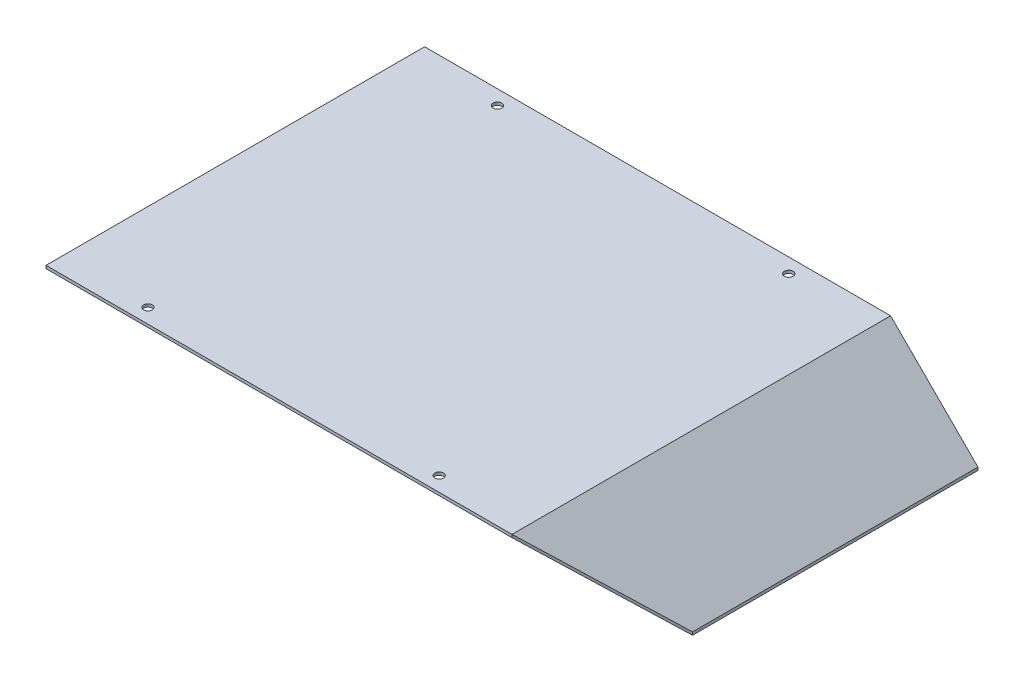
ISO-10303-21;
HEADER;
FILE_DESCRIPTION(('STEP AP214'),'2;1');
FILE_NAME('part.step','',(''),(''),'','','');
FILE_SCHEMA(('AUTOMOTIVE_DESIGN { 1 0 10303 214 1 1 1 1 }'));
ENDSEC;
DATA;
#1=APPLICATION_CONTEXT('core data for automotive mechanical design processes');
#2=APPLICATION_PROTOCOL_DEFINITION('international standard','automotive_design',2000,#1);
#3=PRODUCT_CONTEXT('',#1,'mechanical');
#4=PRODUCT('Part','Part','',(#3));
#5=PRODUCT_RELATED_PRODUCT_CATEGORY('part','',(#4));
#6=PRODUCT_DEFINITION_FORMATION('','',#4);
#7=PRODUCT_DEFINITION_CONTEXT('part definition',#1,'design');
#8=PRODUCT_DEFINITION('design','',#6,#7);
#9=PRODUCT_DEFINITION_SHAPE('','',#8);
#10=(LENGTH_UNIT() NAMED_UNIT(*) SI_UNIT(.MILLI.,.METRE.));
#11=(NAMED_UNIT(*) PLANE_ANGLE_UNIT() SI_UNIT($,.RADIAN.));
#12=(NAMED_UNIT(*) SI_UNIT($,.STERADIAN.) SOLID_ANGLE_UNIT());
#13=UNCERTAINTY_MEASURE_WITH_UNIT(LENGTH_MEASURE(1.E-05),#10,'distance_accuracy_value','');
#14=(GEOMETRIC_REPRESENTATION_CONTEXT(3) GLOBAL_UNCERTAINTY_ASSIGNED_CONTEXT((#13)) GLOBAL_UNIT_ASSIGNED_CONTEXT((#10,
#11,#12)) REPRESENTATION_CONTEXT('',''));
#15=CARTESIAN_POINT('',(0.,0.,0.));
#16=DIRECTION('',(0.,0.,1.));
#17=DIRECTION('',(1.,0.,0.));
#18=AXIS2_PLACEMENT_3D('',#15,#16,#17);
#19=CARTESIAN_POINT('',(0.,0.,98.));
#20=DIRECTION('',(0.707106781186548,-0.707106781186547,0.));
#21=DIRECTION('',(0.,0.,-1.));
#22=AXIS2_PLACEMENT_3D('',#19,#20,#21);
#23=PLANE('',#22);
#24=DIRECTION('',(0.,0.,-1.));
#25=VECTOR('',#24,1.);
#26=CARTESIAN_POINT('',(0.,0.,98.));
#27=LINE('',#26,#25);
#28=CARTESIAN_POINT('',(0.,0.,98.));
#29=VERTEX_POINT('',#28);
#30=CARTESIAN_POINT('',(0.,0.,0.));
#31=VERTEX_POINT('',#30);
#32=EDGE_CURVE('E156',#29,#31,#27,.T.);
#33=ORIENTED_EDGE('',*,*,#32,.T.);
#34=DIRECTION('',(0.707106781186548,0.707106781186548,0.));
#35=VECTOR('',#34,1.);
#36=CARTESIAN_POINT('',(0.,0.,0.));
#37=LINE('',#36,#35);
#38=CARTESIAN_POINT('',(30.,30.,0.));
#39=VERTEX_POINT('',#38);
#40=EDGE_CURVE('E231',#31,#39,#37,.T.);
#41=ORIENTED_EDGE('',*,*,#40,.T.);
#42=DIRECTION('',(0.,0.,-1.));
#43=VECTOR('',#42,1.);
#44=CARTESIAN_POINT('',(30.,30.,0.));
#45=LINE('',#44,#43);
#46=CARTESIAN_POINT('',(30.,30.,130.));
#47=VERTEX_POINT('',#46);
#48=EDGE_CURVE('E184',#47,#39,#45,.T.);
#49=ORIENTED_EDGE('',*,*,#48,.F.);
#50=DIRECTION('',(0.564532447121236,0.564532447121236,0.602167943595985));
#51=VECTOR('',#50,1.);
#52=CARTESIAN_POINT('',(0.,0.,98.));
#53=LINE('',#52,#51);
#54=EDGE_CURVE('E11',#29,#47,#53,.T.);
#55=ORIENTED_EDGE('',*,*,#54,.F.);
#56=EDGE_LOOP('',(#33,#41,#49,#55));
#57=FACE_BOUND('',#56,.T.);
#58=ADVANCED_FACE('F16',(#57),#23,.T.);
#59=CARTESIAN_POINT('',(0.,0.99999999999997,98.));
#60=DIRECTION('',(-0.729537204140085,0.,0.68394112888133));
#61=DIRECTION('',(0.,1.,0.));
#62=AXIS2_PLACEMENT_3D('',#59,#60,#61);
#63=PLANE('',#62);
#64=DIRECTION('',(0.,-1.,0.));
#65=VECTOR('',#64,1.);
#66=CARTESIAN_POINT('',(0.,0.99999999999997,98.));
#67=LINE('',#66,#65);
#68=CARTESIAN_POINT('',(0.,0.99999999999997,98.));
#69=VERTEX_POINT('',#68);
#70=EDGE_CURVE('E160',#69,#29,#67,.T.);
#71=ORIENTED_EDGE('',*,*,#70,.T.);
#72=ORIENTED_EDGE('',*,*,#54,.T.);
#73=DIRECTION('',(0.,-1.,0.));
#74=VECTOR('',#73,1.);
#75=CARTESIAN_POINT('',(30.,30.,130.));
#76=LINE('',#75,#74);
#77=CARTESIAN_POINT('',(30.,31.,130.));
#78=VERTEX_POINT('',#77);
#79=EDGE_CURVE('E150',#78,#47,#76,.T.);
#80=ORIENTED_EDGE('',*,*,#79,.F.);
#81=DIRECTION('',(0.564532447121236,0.564532447121236,0.602167943595985));
#82=VECTOR('',#81,1.);
#83=CARTESIAN_POINT('',(0.,0.99999999999997,98.));
#84=LINE('',#83,#82);
#85=EDGE_CURVE('E27',#69,#78,#84,.T.);
#86=ORIENTED_EDGE('',*,*,#85,.F.);
#87=EDGE_LOOP('',(#71,#72,#80,#86));
#88=FACE_BOUND('',#87,.T.);
#89=ADVANCED_FACE('F282',(#88),#63,.T.);
#90=CARTESIAN_POINT('',(0.,1.,0.));
#91=DIRECTION('',(-0.707106781186548,0.707106781186547,0.));
#92=DIRECTION('',(0.,0.,1.));
#93=AXIS2_PLACEMENT_3D('',#90,#91,#92);
#94=PLANE('',#93);
#95=DIRECTION('',(0.,0.,1.));
#96=VECTOR('',#95,1.);
#97=CARTESIAN_POINT('',(0.,1.,0.));
#98=LINE('',#97,#96);
#99=CARTESIAN_POINT('',(0.,1.,0.));
#100=VERTEX_POINT('',#99);
#101=EDGE_CURVE('E220',#100,#69,#98,.T.);
#102=ORIENTED_EDGE('',*,*,#101,.T.);
#103=ORIENTED_EDGE('',*,*,#85,.T.);
#104=DIRECTION('',(0.,0.,1.));
#105=VECTOR('',#104,1.);
#106=CARTESIAN_POINT('',(30.,31.,130.));
#107=LINE('',#106,#105);
#108=CARTESIAN_POINT('',(30.,31.,0.));
#109=VERTEX_POINT('',#108);
#110=EDGE_CURVE('E185',#109,#78,#107,.T.);
#111=ORIENTED_EDGE('',*,*,#110,.F.);
#112=DIRECTION('',(0.707106781186547,0.707106781186548,0.));
#113=VECTOR('',#112,1.);
#114=CARTESIAN_POINT('',(0.,1.,0.));
#115=LINE('',#114,#113);
#116=EDGE_CURVE('E229',#100,#109,#115,.T.);
#117=ORIENTED_EDGE('',*,*,#116,.F.);
#118=EDGE_LOOP('',(#102,#103,#111,#117));
#119=FACE_BOUND('',#118,.T.);
#120=ADVANCED_FACE('F276',(#119),#94,.T.);
#121=CARTESIAN_POINT('',(0.,0.,0.));
#122=DIRECTION('',(0.,0.,-1.));
#123=DIRECTION('',(-1.,0.,0.));
#124=AXIS2_PLACEMENT_3D('',#121,#122,#123);
#125=PLANE('',#124);
#126=DIRECTION('',(0.,1.,0.));
#127=VECTOR('',#126,1.);
#128=CARTESIAN_POINT('',(0.,0.,0.));
#129=LINE('',#128,#127);
#130=EDGE_CURVE('E161',#31,#100,#129,.T.);
#131=ORIENTED_EDGE('',*,*,#130,.T.);
#132=ORIENTED_EDGE('',*,*,#116,.T.);
#133=DIRECTION('',(1.,0.,0.));
#134=VECTOR('',#133,1.);
#135=CARTESIAN_POINT('',(30.,31.,0.));
#136=LINE('',#135,#134);
#137=CARTESIAN_POINT('',(190.,31.,0.));
#138=VERTEX_POINT('',#137);
#139=EDGE_CURVE('E189',#109,#138,#136,.T.);
#140=ORIENTED_EDGE('',*,*,#139,.T.);
#141=DIRECTION('',(0.707106781186548,-0.707106781186547,0.));
#142=VECTOR('',#141,1.);
#143=CARTESIAN_POINT('',(190.,31.,0.));
#144=LINE('',#143,#142);
#145=CARTESIAN_POINT('',(220.,1.,0.));
#146=VERTEX_POINT('',#145);
#147=EDGE_CURVE('E168',#138,#146,#144,.T.);
#148=ORIENTED_EDGE('',*,*,#147,.T.);
#149=DIRECTION('',(0.,1.,0.));
#150=VECTOR('',#149,1.);
#151=CARTESIAN_POINT('',(220.,0.,0.));
#152=LINE('',#151,#150);
#153=CARTESIAN_POINT('',(220.,0.,0.));
#154=VERTEX_POINT('',#153);
#155=EDGE_CURVE('E213',#154,#146,#152,.T.);
#156=ORIENTED_EDGE('',*,*,#155,.F.);
#157=DIRECTION('',(0.707106781186548,-0.707106781186548,0.));
#158=VECTOR('',#157,1.);
#159=CARTESIAN_POINT('',(190.,30.,0.));
#160=LINE('',#159,#158);
#161=CARTESIAN_POINT('',(190.,30.,0.));
#162=VERTEX_POINT('',#161);
#163=EDGE_CURVE('E246',#162,#154,#160,.T.);
#164=ORIENTED_EDGE('',*,*,#163,.F.);
#165=DIRECTION('',(1.,0.,0.));
#166=VECTOR('',#165,1.);
#167=CARTESIAN_POINT('',(30.,30.,0.));
#168=LINE('',#167,#166);
#169=EDGE_CURVE('E181',#39,#162,#168,.T.);
#170=ORIENTED_EDGE('',*,*,#169,.F.);
#171=ORIENTED_EDGE('',*,*,#40,.F.);
#172=EDGE_LOOP('',(#131,#132,#140,#148,#156,#164,#170,#171));
#173=FACE_BOUND('',#172,.T.);
#174=ADVANCED_FACE('F490',(#173),#125,.T.);
#175=CARTESIAN_POINT('',(0.,0.499999999999985,49.));
#176=DIRECTION('',(1.,0.,0.));
#177=DIRECTION('',(0.,1.,0.));
#178=AXIS2_PLACEMENT_3D('',#175,#176,#177);
#179=PLANE('',#178);
#180=ORIENTED_EDGE('',*,*,#130,.F.);
#181=ORIENTED_EDGE('',*,*,#32,.F.);
#182=ORIENTED_EDGE('',*,*,#70,.F.);
#183=ORIENTED_EDGE('',*,*,#101,.F.);
#184=EDGE_LOOP('',(#180,#181,#182,#183));
#185=FACE_BOUND('',#184,.T.);
#186=ADVANCED_FACE('F281',(#185),#179,.F.);
#187=CARTESIAN_POINT('',(30.,31.,130.));
#188=DIRECTION('',(0.,-1.,0.));
#189=DIRECTION('',(0.,0.,-1.));
#190=AXIS2_PLACEMENT_3D('',#187,#188,#189);
#191=PLANE('',#190);
#192=CARTESIAN_POINT('',(160.,31.,5.));
#193=DIRECTION('',(0.,-1.,0.));
#194=DIRECTION('',(1.,0.,0.));
#195=AXIS2_PLACEMENT_3D('',#192,#193,#194);
#196=CIRCLE('',#195,1.5);
#197=CARTESIAN_POINT('',(158.5,31.,5.));
#198=VERTEX_POINT('',#197);
#199=EDGE_CURVE('E173',#198,#198,#196,.T.);
#200=ORIENTED_EDGE('',*,*,#199,.T.);
#201=EDGE_LOOP('',(#200));
#202=FACE_BOUND('',#201,.T.);
#203=CARTESIAN_POINT('',(60.,31.,125.));
#204=DIRECTION('',(0.,-1.,0.));
#205=DIRECTION('',(1.,0.,0.));
#206=AXIS2_PLACEMENT_3D('',#203,#204,#205);
#207=CIRCLE('',#206,1.5);
#208=CARTESIAN_POINT('',(58.5,31.,125.));
#209=VERTEX_POINT('',#208);
#210=EDGE_CURVE('E193',#209,#209,#207,.T.);
#211=ORIENTED_EDGE('',*,*,#210,.T.);
#212=EDGE_LOOP('',(#211));
#213=FACE_BOUND('',#212,.T.);
#214=CARTESIAN_POINT('',(60.,31.,5.));
#215=DIRECTION('',(0.,-1.,0.));
#216=DIRECTION('',(1.,0.,0.));
#217=AXIS2_PLACEMENT_3D('',#214,#215,#216);
#218=CIRCLE('',#217,1.5);
#219=CARTESIAN_POINT('',(58.5,31.,5.));
#220=VERTEX_POINT('',#219);
#221=EDGE_CURVE('E135',#220,#220,#218,.T.);
#222=ORIENTED_EDGE('',*,*,#221,.T.);
#223=EDGE_LOOP('',(#222));
#224=FACE_BOUND('',#223,.T.);
#225=CARTESIAN_POINT('',(160.,31.,125.));
#226=DIRECTION('',(0.,-1.,0.));
#227=DIRECTION('',(1.,0.,0.));
#228=AXIS2_PLACEMENT_3D('',#225,#226,#227);
#229=CIRCLE('',#228,1.5);
#230=CARTESIAN_POINT('',(158.5,31.,125.));
#231=VERTEX_POINT('',#230);
#232=EDGE_CURVE('E145',#231,#231,#229,.T.);
#233=ORIENTED_EDGE('',*,*,#232,.T.);
#234=EDGE_LOOP('',(#233));
#235=FACE_BOUND('',#234,.T.);
#236=ORIENTED_EDGE('',*,*,#110,.T.);
#237=DIRECTION('',(1.,0.,0.));
#238=VECTOR('',#237,1.);
#239=CARTESIAN_POINT('',(30.,31.,130.));
#240=LINE('',#239,#238);
#241=CARTESIAN_POINT('',(190.,31.,130.));
#242=VERTEX_POINT('',#241);
#243=EDGE_CURVE('E154',#78,#242,#240,.T.);
#244=ORIENTED_EDGE('',*,*,#243,.T.);
#245=DIRECTION('',(0.,0.,-1.));
#246=VECTOR('',#245,1.);
#247=CARTESIAN_POINT('',(190.,31.,0.));
#248=LINE('',#247,#246);
#249=EDGE_CURVE('E224',#242,#138,#248,.T.);
#250=ORIENTED_EDGE('',*,*,#249,.T.);
#251=ORIENTED_EDGE('',*,*,#139,.F.);
#252=EDGE_LOOP('',(#236,#244,#250,#251));
#253=FACE_BOUND('',#252,.T.);
#254=ADVANCED_FACE('F421',(#202,#213,#224,#235,#253),#191,.F.);
#255=CARTESIAN_POINT('',(30.,30.,130.));
#256=DIRECTION('',(0.,0.,-1.));
#257=DIRECTION('',(0.,-1.,0.));
#258=AXIS2_PLACEMENT_3D('',#255,#256,#257);
#259=PLANE('',#258);
#260=ORIENTED_EDGE('',*,*,#79,.T.);
#261=DIRECTION('',(1.,0.,0.));
#262=VECTOR('',#261,1.);
#263=CARTESIAN_POINT('',(30.,30.,130.));
#264=LINE('',#263,#262);
#265=CARTESIAN_POINT('',(190.,30.,130.));
#266=VERTEX_POINT('',#265);
#267=EDGE_CURVE('E155',#47,#266,#264,.T.);
#268=ORIENTED_EDGE('',*,*,#267,.T.);
#269=DIRECTION('',(0.,1.,0.));
#270=VECTOR('',#269,1.);
#271=CARTESIAN_POINT('',(190.,31.,130.));
#272=LINE('',#271,#270);
#273=EDGE_CURVE('E171',#266,#242,#272,.T.);
#274=ORIENTED_EDGE('',*,*,#273,.T.);
#275=ORIENTED_EDGE('',*,*,#243,.F.);
#276=EDGE_LOOP('',(#260,#268,#274,#275));
#277=FACE_BOUND('',#276,.T.);
#278=ADVANCED_FACE('F288',(#277),#259,.F.);
#279=CARTESIAN_POINT('',(30.,30.,0.));
#280=DIRECTION('',(0.,1.,0.));
#281=DIRECTION('',(0.,0.,-1.));
#282=AXIS2_PLACEMENT_3D('',#279,#280,#281);
#283=PLANE('',#282);
#284=CARTESIAN_POINT('',(160.,30.,5.));
#285=DIRECTION('',(0.,1.,0.));
#286=DIRECTION('',(1.,0.,0.));
#287=AXIS2_PLACEMENT_3D('',#284,#285,#286);
#288=CIRCLE('',#287,1.5);
#289=CARTESIAN_POINT('',(158.5,30.,5.));
#290=VERTEX_POINT('',#289);
#291=EDGE_CURVE('E216',#290,#290,#288,.T.);
#292=ORIENTED_EDGE('',*,*,#291,.T.);
#293=EDGE_LOOP('',(#292));
#294=FACE_BOUND('',#293,.T.);
#295=CARTESIAN_POINT('',(60.,30.,125.));
#296=DIRECTION('',(0.,1.,0.));
#297=DIRECTION('',(1.,0.,0.));
#298=AXIS2_PLACEMENT_3D('',#295,#296,#297);
#299=CIRCLE('',#298,1.5);
#300=CARTESIAN_POINT('',(58.5,30.,125.));
#301=VERTEX_POINT('',#300);
#302=EDGE_CURVE('E178',#301,#301,#299,.T.);
#303=ORIENTED_EDGE('',*,*,#302,.T.);
#304=EDGE_LOOP('',(#303));
#305=FACE_BOUND('',#304,.T.);
#306=CARTESIAN_POINT('',(60.,30.,5.));
#307=DIRECTION('',(0.,1.,0.));
#308=DIRECTION('',(1.,0.,0.));
#309=AXIS2_PLACEMENT_3D('',#306,#307,#308);
#310=CIRCLE('',#309,1.5);
#311=CARTESIAN_POINT('',(58.5,30.,5.));
#312=VERTEX_POINT('',#311);
#313=EDGE_CURVE('E148',#312,#312,#310,.T.);
#314=ORIENTED_EDGE('',*,*,#313,.T.);
#315=EDGE_LOOP('',(#314));
#316=FACE_BOUND('',#315,.T.);
#317=CARTESIAN_POINT('',(160.,30.,125.));
#318=DIRECTION('',(0.,1.,0.));
#319=DIRECTION('',(1.,0.,0.));
#320=AXIS2_PLACEMENT_3D('',#317,#318,#319);
#321=CIRCLE('',#320,1.5);
#322=CARTESIAN_POINT('',(158.5,30.,125.));
#323=VERTEX_POINT('',#322);
#324=EDGE_CURVE('E129',#323,#323,#321,.T.);
#325=ORIENTED_EDGE('',*,*,#324,.T.);
#326=EDGE_LOOP('',(#325));
#327=FACE_BOUND('',#326,.T.);
#328=ORIENTED_EDGE('',*,*,#48,.T.);
#329=ORIENTED_EDGE('',*,*,#169,.T.);
#330=DIRECTION('',(0.,0.,1.));
#331=VECTOR('',#330,1.);
#332=CARTESIAN_POINT('',(190.,30.,130.));
#333=LINE('',#332,#331);
#334=EDGE_CURVE('E242',#162,#266,#333,.T.);
#335=ORIENTED_EDGE('',*,*,#334,.T.);
#336=ORIENTED_EDGE('',*,*,#267,.F.);
#337=EDGE_LOOP('',(#328,#329,#335,#336));
#338=FACE_BOUND('',#337,.T.);
#339=ADVANCED_FACE('F130',(#294,#305,#316,#327,#338),#283,.F.);
#340=CARTESIAN_POINT('',(190.,30.,130.));
#341=DIRECTION('',(-0.707106781186548,-0.707106781186548,0.));
#342=DIRECTION('',(-0.707106781186548,0.707106781186548,0.));
#343=AXIS2_PLACEMENT_3D('',#340,#341,#342);
#344=PLANE('',#343);
#345=ORIENTED_EDGE('',*,*,#334,.F.);
#346=ORIENTED_EDGE('',*,*,#163,.T.);
#347=DIRECTION('',(0.,0.,-1.));
#348=VECTOR('',#347,1.);
#349=CARTESIAN_POINT('',(220.,0.,98.));
#350=LINE('',#349,#348);
#351=CARTESIAN_POINT('',(220.,0.,98.));
#352=VERTEX_POINT('',#351);
#353=EDGE_CURVE('E166',#352,#154,#350,.T.);
#354=ORIENTED_EDGE('',*,*,#353,.F.);
#355=DIRECTION('',(0.564532447121236,-0.564532447121236,-0.602167943595985));
#356=VECTOR('',#355,1.);
#357=CARTESIAN_POINT('',(190.,30.,130.));
#358=LINE('',#357,#356);
#359=EDGE_CURVE('E228',#266,#352,#358,.T.);
#360=ORIENTED_EDGE('',*,*,#359,.F.);
#361=EDGE_LOOP('',(#345,#346,#354,#360));
#362=FACE_BOUND('',#361,.T.);
#363=ADVANCED_FACE('F448',(#362),#344,.T.);
#364=CARTESIAN_POINT('',(190.,31.,130.));
#365=DIRECTION('',(0.729537204140086,0.,0.683941128881329));
#366=DIRECTION('',(0.,-1.,0.));
#367=AXIS2_PLACEMENT_3D('',#364,#365,#366);
#368=PLANE('',#367);
#369=ORIENTED_EDGE('',*,*,#273,.F.);
#370=ORIENTED_EDGE('',*,*,#359,.T.);
#371=DIRECTION('',(0.,-1.,0.));
#372=VECTOR('',#371,1.);
#373=CARTESIAN_POINT('',(220.,1.,98.));
#374=LINE('',#373,#372);
#375=CARTESIAN_POINT('',(220.,1.,98.));
#376=VERTEX_POINT('',#375);
#377=EDGE_CURVE('E162',#376,#352,#374,.T.);
#378=ORIENTED_EDGE('',*,*,#377,.F.);
#379=DIRECTION('',(0.564532447121236,-0.564532447121236,-0.602167943595986));
#380=VECTOR('',#379,1.);
#381=CARTESIAN_POINT('',(190.,31.,130.));
#382=LINE('',#381,#380);
#383=EDGE_CURVE('E172',#242,#376,#382,.T.);
#384=ORIENTED_EDGE('',*,*,#383,.F.);
#385=EDGE_LOOP('',(#369,#370,#378,#384));
#386=FACE_BOUND('',#385,.T.);
#387=ADVANCED_FACE('F375',(#386),#368,.T.);
#388=CARTESIAN_POINT('',(190.,31.,0.));
#389=DIRECTION('',(0.707106781186547,0.707106781186548,0.));
#390=DIRECTION('',(0.,0.,-1.));
#391=AXIS2_PLACEMENT_3D('',#388,#389,#390);
#392=PLANE('',#391);
#393=ORIENTED_EDGE('',*,*,#249,.F.);
#394=ORIENTED_EDGE('',*,*,#383,.T.);
#395=DIRECTION('',(0.,0.,1.));
#396=VECTOR('',#395,1.);
#397=CARTESIAN_POINT('',(220.,1.,0.));
#398=LINE('',#397,#396);
#399=EDGE_CURVE('E167',#146,#376,#398,.T.);
#400=ORIENTED_EDGE('',*,*,#399,.F.);
#401=ORIENTED_EDGE('',*,*,#147,.F.);
#402=EDGE_LOOP('',(#393,#394,#400,#401));
#403=FACE_BOUND('',#402,.T.);
#404=ADVANCED_FACE('F369',(#403),#392,.T.);
#405=CARTESIAN_POINT('',(220.,0.5,49.));
#406=DIRECTION('',(1.,0.,0.));
#407=DIRECTION('',(0.,1.,0.));
#408=AXIS2_PLACEMENT_3D('',#405,#406,#407);
#409=PLANE('',#408);
#410=ORIENTED_EDGE('',*,*,#155,.T.);
#411=ORIENTED_EDGE('',*,*,#399,.T.);
#412=ORIENTED_EDGE('',*,*,#377,.T.);
#413=ORIENTED_EDGE('',*,*,#353,.T.);
#414=EDGE_LOOP('',(#410,#411,#412,#413));
#415=FACE_BOUND('',#414,.T.);
#416=ADVANCED_FACE('F18',(#415),#409,.T.);
#417=CARTESIAN_POINT('',(160.,27.,5.));
#418=DIRECTION('',(0.,1.,0.));
#419=DIRECTION('',(1.,0.,0.));
#420=AXIS2_PLACEMENT_3D('',#417,#418,#419);
#421=CYLINDRICAL_SURFACE('',#420,1.5);
#422=ORIENTED_EDGE('',*,*,#199,.F.);
#423=DIRECTION('',(0.,-1.,0.));
#424=VECTOR('',#423,1.);
#425=CARTESIAN_POINT('',(158.5,27.,5.));
#426=LINE('',#425,#424);
#427=EDGE_CURVE('E177',#198,#290,#426,.T.);
#428=ORIENTED_EDGE('',*,*,#427,.T.);
#429=ORIENTED_EDGE('',*,*,#291,.F.);
#430=ORIENTED_EDGE('',*,*,#427,.F.);
#431=EDGE_LOOP('',(#422,#428,#429,#430));
#432=FACE_BOUND('',#431,.T.);
#433=ADVANCED_FACE('F409',(#432),#421,.F.);
#434=CARTESIAN_POINT('',(60.,27.,125.));
#435=DIRECTION('',(0.,1.,0.));
#436=DIRECTION('',(1.,0.,0.));
#437=AXIS2_PLACEMENT_3D('',#434,#435,#436);
#438=CYLINDRICAL_SURFACE('',#437,1.5);
#439=ORIENTED_EDGE('',*,*,#210,.F.);
#440=DIRECTION('',(0.,-1.,0.));
#441=VECTOR('',#440,1.);
#442=CARTESIAN_POINT('',(58.5,27.,125.));
#443=LINE('',#442,#441);
#444=EDGE_CURVE('E190',#209,#301,#443,.T.);
#445=ORIENTED_EDGE('',*,*,#444,.T.);
#446=ORIENTED_EDGE('',*,*,#302,.F.);
#447=ORIENTED_EDGE('',*,*,#444,.F.);
#448=EDGE_LOOP('',(#439,#445,#446,#447));
#449=FACE_BOUND('',#448,.T.);
#450=ADVANCED_FACE('F202',(#449),#438,.F.);
#451=CARTESIAN_POINT('',(60.,27.,5.));
#452=DIRECTION('',(0.,1.,0.));
#453=DIRECTION('',(1.,0.,0.));
#454=AXIS2_PLACEMENT_3D('',#451,#452,#453);
#455=CYLINDRICAL_SURFACE('',#454,1.5);
#456=ORIENTED_EDGE('',*,*,#221,.F.);
#457=DIRECTION('',(0.,-1.,0.));
#458=VECTOR('',#457,1.);
#459=CARTESIAN_POINT('',(58.5,27.,5.));
#460=LINE('',#459,#458);
#461=EDGE_CURVE('E143',#220,#312,#460,.T.);
#462=ORIENTED_EDGE('',*,*,#461,.T.);
#463=ORIENTED_EDGE('',*,*,#313,.F.);
#464=ORIENTED_EDGE('',*,*,#461,.F.);
#465=EDGE_LOOP('',(#456,#462,#463,#464));
#466=FACE_BOUND('',#465,.T.);
#467=ADVANCED_FACE('F408',(#466),#455,.F.);
#468=CARTESIAN_POINT('',(160.,27.,125.));
#469=DIRECTION('',(0.,1.,0.));
#470=DIRECTION('',(1.,0.,0.));
#471=AXIS2_PLACEMENT_3D('',#468,#469,#470);
#472=CYLINDRICAL_SURFACE('',#471,1.5);
#473=ORIENTED_EDGE('',*,*,#232,.F.);
#474=DIRECTION('',(0.,-1.,0.));
#475=VECTOR('',#474,1.);
#476=CARTESIAN_POINT('',(158.5,27.,125.));
#477=LINE('',#476,#475);
#478=EDGE_CURVE('E20',#231,#323,#477,.T.);
#479=ORIENTED_EDGE('',*,*,#478,.T.);
#480=ORIENTED_EDGE('',*,*,#324,.F.);
#481=ORIENTED_EDGE('',*,*,#478,.F.);
#482=EDGE_LOOP('',(#473,#479,#480,#481));
#483=FACE_BOUND('',#482,.T.);
#484=ADVANCED_FACE('F429',(#483),#472,.F.);
#485=CLOSED_SHELL('',(#58,#89,#120,#174,#186,#254,#278,#339,#363,#387,#404,#416,#433,#450,#467,#484));
#486=MANIFOLD_SOLID_BREP('B1',#485);
#487=ADVANCED_BREP_SHAPE_REPRESENTATION('',(#18,#486),#14);
#488=SHAPE_DEFINITION_REPRESENTATION(#9,#487);
ENDSEC;
END-ISO-10303-21;
